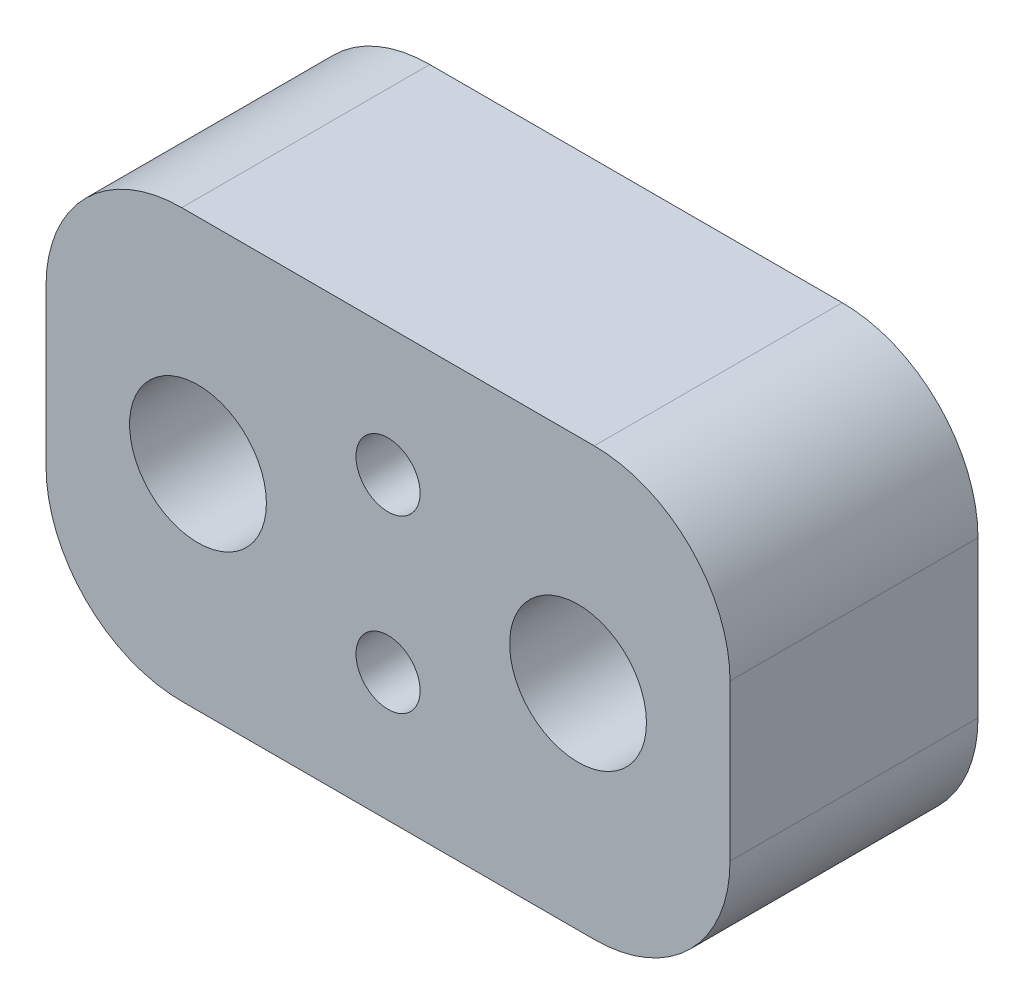
ISO-10303-21;
HEADER;
FILE_DESCRIPTION(('STEP AP214'),'2;1');
FILE_NAME('part.step','',(''),(''),'','','');
FILE_SCHEMA(('AUTOMOTIVE_DESIGN { 1 0 10303 214 1 1 1 1 }'));
ENDSEC;
DATA;
#1=APPLICATION_CONTEXT('core data for automotive mechanical design processes');
#2=APPLICATION_PROTOCOL_DEFINITION('international standard','automotive_design',2000,#1);
#3=PRODUCT_CONTEXT('',#1,'mechanical');
#4=PRODUCT('Part','Part','',(#3));
#5=PRODUCT_RELATED_PRODUCT_CATEGORY('part','',(#4));
#6=PRODUCT_DEFINITION_FORMATION('','',#4);
#7=PRODUCT_DEFINITION_CONTEXT('part definition',#1,'design');
#8=PRODUCT_DEFINITION('design','',#6,#7);
#9=PRODUCT_DEFINITION_SHAPE('','',#8);
#10=(LENGTH_UNIT() NAMED_UNIT(*) SI_UNIT(.MILLI.,.METRE.));
#11=(NAMED_UNIT(*) PLANE_ANGLE_UNIT() SI_UNIT($,.RADIAN.));
#12=(NAMED_UNIT(*) SI_UNIT($,.STERADIAN.) SOLID_ANGLE_UNIT());
#13=UNCERTAINTY_MEASURE_WITH_UNIT(LENGTH_MEASURE(1.E-05),#10,'distance_accuracy_value','');
#14=(GEOMETRIC_REPRESENTATION_CONTEXT(3) GLOBAL_UNCERTAINTY_ASSIGNED_CONTEXT((#13)) GLOBAL_UNIT_ASSIGNED_CONTEXT((#10,
#11,#12)) REPRESENTATION_CONTEXT('',''));
#15=CARTESIAN_POINT('',(0.,0.,0.));
#16=DIRECTION('',(0.,0.,1.));
#17=DIRECTION('',(1.,0.,0.));
#18=AXIS2_PLACEMENT_3D('',#15,#16,#17);
#19=CARTESIAN_POINT('',(0.,10.,5.8));
#20=DIRECTION('',(0.,0.,-1.));
#21=DIRECTION('',(-1.,0.,0.));
#22=AXIS2_PLACEMENT_3D('',#19,#20,#21);
#23=PLANE('',#22);
#24=CARTESIAN_POINT('',(3.555,5.,5.8));
#25=DIRECTION('',(0.,0.,1.));
#26=DIRECTION('',(1.,0.,0.));
#27=AXIS2_PLACEMENT_3D('',#24,#25,#26);
#28=CIRCLE('',#27,1.59999999999999);
#29=CARTESIAN_POINT('',(5.15499999999999,5.,5.8));
#30=VERTEX_POINT('',#29);
#31=EDGE_CURVE('E146',#30,#30,#28,.T.);
#32=ORIENTED_EDGE('',*,*,#31,.F.);
#33=EDGE_LOOP('',(#32));
#34=FACE_BOUND('',#33,.T.);
#35=DIRECTION('',(0.,-1.,0.));
#36=VECTOR('',#35,1.);
#37=CARTESIAN_POINT('',(0.,0.,5.8));
#38=LINE('',#37,#36);
#39=CARTESIAN_POINT('',(0.,6.825,5.8));
#40=VERTEX_POINT('',#39);
#41=CARTESIAN_POINT('',(0.,3.175,5.8));
#42=VERTEX_POINT('',#41);
#43=EDGE_CURVE('E137',#40,#42,#38,.T.);
#44=ORIENTED_EDGE('',*,*,#43,.T.);
#45=CARTESIAN_POINT('',(3.175,3.175,5.8));
#46=DIRECTION('',(0.,0.,-1.));
#47=DIRECTION('',(-1.,0.,0.));
#48=AXIS2_PLACEMENT_3D('',#45,#46,#47);
#49=CIRCLE('',#48,3.175);
#50=CARTESIAN_POINT('',(3.175,0.,5.8));
#51=VERTEX_POINT('',#50);
#52=EDGE_CURVE('E161',#42,#51,#49,.F.);
#53=ORIENTED_EDGE('',*,*,#52,.T.);
#54=DIRECTION('',(1.,0.,0.));
#55=VECTOR('',#54,1.);
#56=CARTESIAN_POINT('',(0.,0.,5.8));
#57=LINE('',#56,#55);
#58=CARTESIAN_POINT('',(12.825,0.,5.8));
#59=VERTEX_POINT('',#58);
#60=EDGE_CURVE('E120',#51,#59,#57,.T.);
#61=ORIENTED_EDGE('',*,*,#60,.T.);
#62=CARTESIAN_POINT('',(12.825,3.175,5.8));
#63=DIRECTION('',(0.,0.,-1.));
#64=DIRECTION('',(-1.,0.,0.));
#65=AXIS2_PLACEMENT_3D('',#62,#63,#64);
#66=CIRCLE('',#65,3.175);
#67=CARTESIAN_POINT('',(16.,3.175,5.8));
#68=VERTEX_POINT('',#67);
#69=EDGE_CURVE('E159',#59,#68,#66,.F.);
#70=ORIENTED_EDGE('',*,*,#69,.T.);
#71=DIRECTION('',(0.,1.,0.));
#72=VECTOR('',#71,1.);
#73=CARTESIAN_POINT('',(16.,0.,5.8));
#74=LINE('',#73,#72);
#75=CARTESIAN_POINT('',(16.,6.825,5.8));
#76=VERTEX_POINT('',#75);
#77=EDGE_CURVE('E172',#68,#76,#74,.T.);
#78=ORIENTED_EDGE('',*,*,#77,.T.);
#79=CARTESIAN_POINT('',(12.825,6.825,5.8));
#80=DIRECTION('',(0.,0.,-1.));
#81=DIRECTION('',(-1.,0.,0.));
#82=AXIS2_PLACEMENT_3D('',#79,#80,#81);
#83=CIRCLE('',#82,3.175);
#84=CARTESIAN_POINT('',(12.825,10.,5.8));
#85=VERTEX_POINT('',#84);
#86=EDGE_CURVE('E55',#76,#85,#83,.F.);
#87=ORIENTED_EDGE('',*,*,#86,.T.);
#88=DIRECTION('',(-1.,0.,0.));
#89=VECTOR('',#88,1.);
#90=CARTESIAN_POINT('',(0.,10.,5.8));
#91=LINE('',#90,#89);
#92=CARTESIAN_POINT('',(3.175,10.,5.8));
#93=VERTEX_POINT('',#92);
#94=EDGE_CURVE('E147',#85,#93,#91,.T.);
#95=ORIENTED_EDGE('',*,*,#94,.T.);
#96=CARTESIAN_POINT('',(3.175,6.825,5.8));
#97=DIRECTION('',(0.,0.,-1.));
#98=DIRECTION('',(-1.,0.,0.));
#99=AXIS2_PLACEMENT_3D('',#96,#97,#98);
#100=CIRCLE('',#99,3.175);
#101=EDGE_CURVE('E156',#93,#40,#100,.F.);
#102=ORIENTED_EDGE('',*,*,#101,.T.);
#103=EDGE_LOOP('',(#44,#53,#61,#70,#78,#87,#95,#102));
#104=FACE_BOUND('',#103,.T.);
#105=CARTESIAN_POINT('',(8.,7.,5.8));
#106=DIRECTION('',(0.,0.,1.));
#107=DIRECTION('',(1.,0.,0.));
#108=AXIS2_PLACEMENT_3D('',#105,#106,#107);
#109=CIRCLE('',#108,0.749999999999997);
#110=CARTESIAN_POINT('',(8.75,7.,5.8));
#111=VERTEX_POINT('',#110);
#112=EDGE_CURVE('E186',#111,#111,#109,.T.);
#113=ORIENTED_EDGE('',*,*,#112,.F.);
#114=EDGE_LOOP('',(#113));
#115=FACE_BOUND('',#114,.T.);
#116=CARTESIAN_POINT('',(8.,3.,5.8));
#117=DIRECTION('',(0.,0.,1.));
#118=DIRECTION('',(1.,0.,0.));
#119=AXIS2_PLACEMENT_3D('',#116,#117,#118);
#120=CIRCLE('',#119,0.749999999999998);
#121=CARTESIAN_POINT('',(8.75,3.,5.8));
#122=VERTEX_POINT('',#121);
#123=EDGE_CURVE('E141',#122,#122,#120,.T.);
#124=ORIENTED_EDGE('',*,*,#123,.F.);
#125=EDGE_LOOP('',(#124));
#126=FACE_BOUND('',#125,.T.);
#127=CARTESIAN_POINT('',(12.445,5.,5.8));
#128=DIRECTION('',(0.,0.,1.));
#129=DIRECTION('',(1.,0.,0.));
#130=AXIS2_PLACEMENT_3D('',#127,#128,#129);
#131=CIRCLE('',#130,1.59999999999999);
#132=CARTESIAN_POINT('',(14.045,5.,5.8));
#133=VERTEX_POINT('',#132);
#134=EDGE_CURVE('E142',#133,#133,#131,.T.);
#135=ORIENTED_EDGE('',*,*,#134,.F.);
#136=EDGE_LOOP('',(#135));
#137=FACE_BOUND('',#136,.T.);
#138=ADVANCED_FACE('F34',(#34,#104,#115,#126,#137),#23,.F.);
#139=CARTESIAN_POINT('',(0.,0.,5.8));
#140=DIRECTION('',(1.,0.,0.));
#141=DIRECTION('',(0.,0.,-1.));
#142=AXIS2_PLACEMENT_3D('',#139,#140,#141);
#143=PLANE('',#142);
#144=DIRECTION('',(0.,-1.,0.));
#145=VECTOR('',#144,1.);
#146=CARTESIAN_POINT('',(0.,0.,0.));
#147=LINE('',#146,#145);
#148=CARTESIAN_POINT('',(0.,6.825,0.));
#149=VERTEX_POINT('',#148);
#150=CARTESIAN_POINT('',(0.,3.175,0.));
#151=VERTEX_POINT('',#150);
#152=EDGE_CURVE('E127',#149,#151,#147,.T.);
#153=ORIENTED_EDGE('',*,*,#152,.T.);
#154=DIRECTION('',(0.,0.,-1.));
#155=VECTOR('',#154,1.);
#156=CARTESIAN_POINT('',(0.,3.175,5.8));
#157=LINE('',#156,#155);
#158=EDGE_CURVE('E105',#151,#42,#157,.F.);
#159=ORIENTED_EDGE('',*,*,#158,.T.);
#160=ORIENTED_EDGE('',*,*,#43,.F.);
#161=DIRECTION('',(0.,0.,-1.));
#162=VECTOR('',#161,1.);
#163=CARTESIAN_POINT('',(0.,6.825,5.8));
#164=LINE('',#163,#162);
#165=EDGE_CURVE('E110',#40,#149,#164,.T.);
#166=ORIENTED_EDGE('',*,*,#165,.T.);
#167=EDGE_LOOP('',(#153,#159,#160,#166));
#168=FACE_BOUND('',#167,.T.);
#169=ADVANCED_FACE('F204',(#168),#143,.F.);
#170=CARTESIAN_POINT('',(0.,0.,5.8));
#171=DIRECTION('',(0.,1.,0.));
#172=DIRECTION('',(0.,0.,1.));
#173=AXIS2_PLACEMENT_3D('',#170,#171,#172);
#174=PLANE('',#173);
#175=ORIENTED_EDGE('',*,*,#60,.F.);
#176=DIRECTION('',(0.,0.,-1.));
#177=VECTOR('',#176,1.);
#178=CARTESIAN_POINT('',(3.175,0.,5.8));
#179=LINE('',#178,#177);
#180=CARTESIAN_POINT('',(3.175,0.,0.));
#181=VERTEX_POINT('',#180);
#182=EDGE_CURVE('E104',#51,#181,#179,.T.);
#183=ORIENTED_EDGE('',*,*,#182,.T.);
#184=DIRECTION('',(1.,0.,0.));
#185=VECTOR('',#184,1.);
#186=CARTESIAN_POINT('',(0.,0.,0.));
#187=LINE('',#186,#185);
#188=CARTESIAN_POINT('',(12.825,0.,0.));
#189=VERTEX_POINT('',#188);
#190=EDGE_CURVE('E117',#181,#189,#187,.T.);
#191=ORIENTED_EDGE('',*,*,#190,.T.);
#192=DIRECTION('',(0.,0.,-1.));
#193=VECTOR('',#192,1.);
#194=CARTESIAN_POINT('',(12.825,0.,5.8));
#195=LINE('',#194,#193);
#196=EDGE_CURVE('E122',#189,#59,#195,.F.);
#197=ORIENTED_EDGE('',*,*,#196,.T.);
#198=EDGE_LOOP('',(#175,#183,#191,#197));
#199=FACE_BOUND('',#198,.T.);
#200=ADVANCED_FACE('F116',(#199),#174,.F.);
#201=CARTESIAN_POINT('',(16.,0.,5.8));
#202=DIRECTION('',(-1.,0.,0.));
#203=DIRECTION('',(0.,0.,1.));
#204=AXIS2_PLACEMENT_3D('',#201,#202,#203);
#205=PLANE('',#204);
#206=ORIENTED_EDGE('',*,*,#77,.F.);
#207=DIRECTION('',(0.,0.,-1.));
#208=VECTOR('',#207,1.);
#209=CARTESIAN_POINT('',(16.,3.175,5.8));
#210=LINE('',#209,#208);
#211=CARTESIAN_POINT('',(16.,3.175,0.));
#212=VERTEX_POINT('',#211);
#213=EDGE_CURVE('E165',#68,#212,#210,.T.);
#214=ORIENTED_EDGE('',*,*,#213,.T.);
#215=DIRECTION('',(0.,1.,0.));
#216=VECTOR('',#215,1.);
#217=CARTESIAN_POINT('',(16.,0.,0.));
#218=LINE('',#217,#216);
#219=CARTESIAN_POINT('',(16.,6.825,0.));
#220=VERTEX_POINT('',#219);
#221=EDGE_CURVE('E126',#212,#220,#218,.T.);
#222=ORIENTED_EDGE('',*,*,#221,.T.);
#223=DIRECTION('',(0.,0.,-1.));
#224=VECTOR('',#223,1.);
#225=CARTESIAN_POINT('',(16.,6.825,5.8));
#226=LINE('',#225,#224);
#227=EDGE_CURVE('E163',#220,#76,#226,.F.);
#228=ORIENTED_EDGE('',*,*,#227,.T.);
#229=EDGE_LOOP('',(#206,#214,#222,#228));
#230=FACE_BOUND('',#229,.T.);
#231=ADVANCED_FACE('F170',(#230),#205,.F.);
#232=CARTESIAN_POINT('',(0.,10.,5.8));
#233=DIRECTION('',(0.,-1.,0.));
#234=DIRECTION('',(0.,0.,-1.));
#235=AXIS2_PLACEMENT_3D('',#232,#233,#234);
#236=PLANE('',#235);
#237=ORIENTED_EDGE('',*,*,#94,.F.);
#238=DIRECTION('',(0.,0.,-1.));
#239=VECTOR('',#238,1.);
#240=CARTESIAN_POINT('',(12.825,10.,5.8));
#241=LINE('',#240,#239);
#242=CARTESIAN_POINT('',(12.825,10.,0.));
#243=VERTEX_POINT('',#242);
#244=EDGE_CURVE('E11',#85,#243,#241,.T.);
#245=ORIENTED_EDGE('',*,*,#244,.T.);
#246=DIRECTION('',(-1.,0.,0.));
#247=VECTOR('',#246,1.);
#248=CARTESIAN_POINT('',(0.,10.,0.));
#249=LINE('',#248,#247);
#250=CARTESIAN_POINT('',(3.175,10.,0.));
#251=VERTEX_POINT('',#250);
#252=EDGE_CURVE('E130',#243,#251,#249,.T.);
#253=ORIENTED_EDGE('',*,*,#252,.T.);
#254=DIRECTION('',(0.,0.,-1.));
#255=VECTOR('',#254,1.);
#256=CARTESIAN_POINT('',(3.175,10.,5.8));
#257=LINE('',#256,#255);
#258=EDGE_CURVE('E42',#251,#93,#257,.F.);
#259=ORIENTED_EDGE('',*,*,#258,.T.);
#260=EDGE_LOOP('',(#237,#245,#253,#259));
#261=FACE_BOUND('',#260,.T.);
#262=ADVANCED_FACE('F179',(#261),#236,.F.);
#263=CARTESIAN_POINT('',(0.,10.,0.));
#264=DIRECTION('',(0.,0.,-1.));
#265=DIRECTION('',(-1.,0.,0.));
#266=AXIS2_PLACEMENT_3D('',#263,#264,#265);
#267=PLANE('',#266);
#268=CARTESIAN_POINT('',(3.555,5.,0.));
#269=DIRECTION('',(0.,0.,-1.));
#270=DIRECTION('',(-1.,0.,0.));
#271=AXIS2_PLACEMENT_3D('',#268,#269,#270);
#272=CIRCLE('',#271,1.59999999999999);
#273=CARTESIAN_POINT('',(1.95500000000001,5.,0.));
#274=VERTEX_POINT('',#273);
#275=EDGE_CURVE('E143',#274,#274,#272,.T.);
#276=ORIENTED_EDGE('',*,*,#275,.F.);
#277=EDGE_LOOP('',(#276));
#278=FACE_BOUND('',#277,.T.);
#279=CARTESIAN_POINT('',(12.445,5.,0.));
#280=DIRECTION('',(0.,0.,-1.));
#281=DIRECTION('',(-1.,0.,0.));
#282=AXIS2_PLACEMENT_3D('',#279,#280,#281);
#283=CIRCLE('',#282,1.59999999999999);
#284=CARTESIAN_POINT('',(10.845,5.,0.));
#285=VERTEX_POINT('',#284);
#286=EDGE_CURVE('E138',#285,#285,#283,.T.);
#287=ORIENTED_EDGE('',*,*,#286,.F.);
#288=EDGE_LOOP('',(#287));
#289=FACE_BOUND('',#288,.T.);
#290=CARTESIAN_POINT('',(8.,3.,0.));
#291=DIRECTION('',(0.,0.,1.));
#292=DIRECTION('',(1.,0.,0.));
#293=AXIS2_PLACEMENT_3D('',#290,#291,#292);
#294=CIRCLE('',#293,0.749999999999998);
#295=CARTESIAN_POINT('',(8.75,3.,0.));
#296=VERTEX_POINT('',#295);
#297=EDGE_CURVE('E189',#296,#296,#294,.T.);
#298=ORIENTED_EDGE('',*,*,#297,.T.);
#299=EDGE_LOOP('',(#298));
#300=FACE_BOUND('',#299,.T.);
#301=CARTESIAN_POINT('',(8.,7.,0.));
#302=DIRECTION('',(0.,0.,1.));
#303=DIRECTION('',(1.,0.,0.));
#304=AXIS2_PLACEMENT_3D('',#301,#302,#303);
#305=CIRCLE('',#304,0.749999999999997);
#306=CARTESIAN_POINT('',(8.75,7.,0.));
#307=VERTEX_POINT('',#306);
#308=EDGE_CURVE('E132',#307,#307,#305,.T.);
#309=ORIENTED_EDGE('',*,*,#308,.T.);
#310=EDGE_LOOP('',(#309));
#311=FACE_BOUND('',#310,.T.);
#312=ORIENTED_EDGE('',*,*,#190,.F.);
#313=CARTESIAN_POINT('',(3.175,3.175,0.));
#314=DIRECTION('',(0.,0.,-1.));
#315=DIRECTION('',(-1.,0.,0.));
#316=AXIS2_PLACEMENT_3D('',#313,#314,#315);
#317=CIRCLE('',#316,3.175);
#318=EDGE_CURVE('E100',#181,#151,#317,.T.);
#319=ORIENTED_EDGE('',*,*,#318,.T.);
#320=ORIENTED_EDGE('',*,*,#152,.F.);
#321=CARTESIAN_POINT('',(3.175,6.825,0.));
#322=DIRECTION('',(0.,0.,-1.));
#323=DIRECTION('',(-1.,0.,0.));
#324=AXIS2_PLACEMENT_3D('',#321,#322,#323);
#325=CIRCLE('',#324,3.175);
#326=EDGE_CURVE('E121',#149,#251,#325,.T.);
#327=ORIENTED_EDGE('',*,*,#326,.T.);
#328=ORIENTED_EDGE('',*,*,#252,.F.);
#329=CARTESIAN_POINT('',(12.825,6.825,0.));
#330=DIRECTION('',(0.,0.,-1.));
#331=DIRECTION('',(-1.,0.,0.));
#332=AXIS2_PLACEMENT_3D('',#329,#330,#331);
#333=CIRCLE('',#332,3.175);
#334=EDGE_CURVE('E150',#243,#220,#333,.T.);
#335=ORIENTED_EDGE('',*,*,#334,.T.);
#336=ORIENTED_EDGE('',*,*,#221,.F.);
#337=CARTESIAN_POINT('',(12.825,3.175,0.));
#338=DIRECTION('',(0.,0.,-1.));
#339=DIRECTION('',(-1.,0.,0.));
#340=AXIS2_PLACEMENT_3D('',#337,#338,#339);
#341=CIRCLE('',#340,3.175);
#342=EDGE_CURVE('E111',#212,#189,#341,.T.);
#343=ORIENTED_EDGE('',*,*,#342,.T.);
#344=EDGE_LOOP('',(#312,#319,#320,#327,#328,#335,#336,#343));
#345=FACE_BOUND('',#344,.T.);
#346=ADVANCED_FACE('F124',(#278,#289,#300,#311,#345),#267,.T.);
#347=CARTESIAN_POINT('',(8.,7.,0.));
#348=DIRECTION('',(0.,0.,1.));
#349=DIRECTION('',(1.,0.,0.));
#350=AXIS2_PLACEMENT_3D('',#347,#348,#349);
#351=CYLINDRICAL_SURFACE('',#350,0.749999999999997);
#352=ORIENTED_EDGE('',*,*,#308,.F.);
#353=EDGE_LOOP('',(#352));
#354=FACE_BOUND('',#353,.T.);
#355=ORIENTED_EDGE('',*,*,#112,.T.);
#356=EDGE_LOOP('',(#355));
#357=FACE_BOUND('',#356,.T.);
#358=ADVANCED_FACE('F225',(#354,#357),#351,.F.);
#359=CARTESIAN_POINT('',(8.,3.,0.));
#360=DIRECTION('',(0.,0.,1.));
#361=DIRECTION('',(1.,0.,0.));
#362=AXIS2_PLACEMENT_3D('',#359,#360,#361);
#363=CYLINDRICAL_SURFACE('',#362,0.749999999999998);
#364=ORIENTED_EDGE('',*,*,#297,.F.);
#365=EDGE_LOOP('',(#364));
#366=FACE_BOUND('',#365,.T.);
#367=ORIENTED_EDGE('',*,*,#123,.T.);
#368=EDGE_LOOP('',(#367));
#369=FACE_BOUND('',#368,.T.);
#370=ADVANCED_FACE('F216',(#366,#369),#363,.F.);
#371=CARTESIAN_POINT('',(12.445,5.,5.8));
#372=DIRECTION('',(0.,0.,1.));
#373=DIRECTION('',(1.,0.,0.));
#374=AXIS2_PLACEMENT_3D('',#371,#372,#373);
#375=CYLINDRICAL_SURFACE('',#374,1.59999999999999);
#376=ORIENTED_EDGE('',*,*,#286,.T.);
#377=EDGE_LOOP('',(#376));
#378=FACE_BOUND('',#377,.T.);
#379=ORIENTED_EDGE('',*,*,#134,.T.);
#380=EDGE_LOOP('',(#379));
#381=FACE_BOUND('',#380,.T.);
#382=ADVANCED_FACE('F214',(#378,#381),#375,.F.);
#383=CARTESIAN_POINT('',(3.555,5.,5.8));
#384=DIRECTION('',(0.,0.,1.));
#385=DIRECTION('',(1.,0.,0.));
#386=AXIS2_PLACEMENT_3D('',#383,#384,#385);
#387=CYLINDRICAL_SURFACE('',#386,1.59999999999999);
#388=ORIENTED_EDGE('',*,*,#275,.T.);
#389=EDGE_LOOP('',(#388));
#390=FACE_BOUND('',#389,.T.);
#391=ORIENTED_EDGE('',*,*,#31,.T.);
#392=EDGE_LOOP('',(#391));
#393=FACE_BOUND('',#392,.T.);
#394=ADVANCED_FACE('F201',(#390,#393),#387,.F.);
#395=CARTESIAN_POINT('',(3.175,3.175,5.8));
#396=DIRECTION('',(0.,0.,-1.));
#397=DIRECTION('',(-1.,0.,0.));
#398=AXIS2_PLACEMENT_3D('',#395,#396,#397);
#399=CYLINDRICAL_SURFACE('',#398,3.175);
#400=ORIENTED_EDGE('',*,*,#52,.F.);
#401=ORIENTED_EDGE('',*,*,#158,.F.);
#402=ORIENTED_EDGE('',*,*,#318,.F.);
#403=ORIENTED_EDGE('',*,*,#182,.F.);
#404=EDGE_LOOP('',(#400,#401,#402,#403));
#405=FACE_BOUND('',#404,.T.);
#406=ADVANCED_FACE('F103',(#405),#399,.T.);
#407=CARTESIAN_POINT('',(12.825,3.175,5.8));
#408=DIRECTION('',(0.,0.,-1.));
#409=DIRECTION('',(-1.,0.,0.));
#410=AXIS2_PLACEMENT_3D('',#407,#408,#409);
#411=CYLINDRICAL_SURFACE('',#410,3.175);
#412=ORIENTED_EDGE('',*,*,#69,.F.);
#413=ORIENTED_EDGE('',*,*,#196,.F.);
#414=ORIENTED_EDGE('',*,*,#342,.F.);
#415=ORIENTED_EDGE('',*,*,#213,.F.);
#416=EDGE_LOOP('',(#412,#413,#414,#415));
#417=FACE_BOUND('',#416,.T.);
#418=ADVANCED_FACE('F246',(#417),#411,.T.);
#419=CARTESIAN_POINT('',(12.825,6.825,5.8));
#420=DIRECTION('',(0.,0.,-1.));
#421=DIRECTION('',(-1.,0.,0.));
#422=AXIS2_PLACEMENT_3D('',#419,#420,#421);
#423=CYLINDRICAL_SURFACE('',#422,3.175);
#424=ORIENTED_EDGE('',*,*,#86,.F.);
#425=ORIENTED_EDGE('',*,*,#227,.F.);
#426=ORIENTED_EDGE('',*,*,#334,.F.);
#427=ORIENTED_EDGE('',*,*,#244,.F.);
#428=EDGE_LOOP('',(#424,#425,#426,#427));
#429=FACE_BOUND('',#428,.T.);
#430=ADVANCED_FACE('F178',(#429),#423,.T.);
#431=CARTESIAN_POINT('',(3.175,6.825,5.8));
#432=DIRECTION('',(0.,0.,-1.));
#433=DIRECTION('',(-1.,0.,0.));
#434=AXIS2_PLACEMENT_3D('',#431,#432,#433);
#435=CYLINDRICAL_SURFACE('',#434,3.175);
#436=ORIENTED_EDGE('',*,*,#101,.F.);
#437=ORIENTED_EDGE('',*,*,#258,.F.);
#438=ORIENTED_EDGE('',*,*,#326,.F.);
#439=ORIENTED_EDGE('',*,*,#165,.F.);
#440=EDGE_LOOP('',(#436,#437,#438,#439));
#441=FACE_BOUND('',#440,.T.);
#442=ADVANCED_FACE('F36',(#441),#435,.T.);
#443=CLOSED_SHELL('',(#138,#169,#200,#231,#262,#346,#358,#370,#382,#394,#406,#418,#430,#442));
#444=MANIFOLD_SOLID_BREP('B2',#443);
#445=ADVANCED_BREP_SHAPE_REPRESENTATION('',(#18,#444),#14);
#446=SHAPE_DEFINITION_REPRESENTATION(#9,#445);
ENDSEC;
END-ISO-10303-21;
